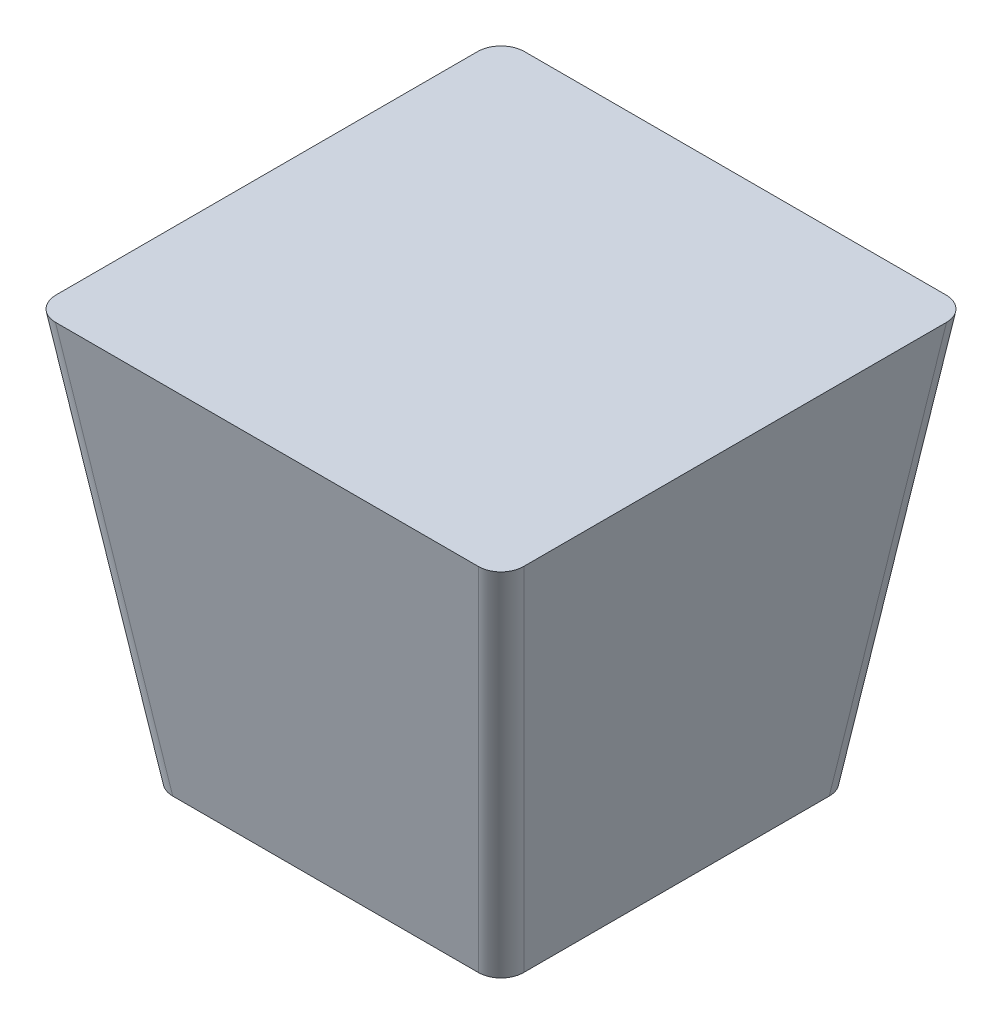
ISO-10303-21;
HEADER;
FILE_DESCRIPTION(('STEP AP214'),'2;1');
FILE_NAME('part.step','',(''),(''),'','','');
FILE_SCHEMA(('AUTOMOTIVE_DESIGN { 1 0 10303 214 1 1 1 1 }'));
ENDSEC;
DATA;
#1=APPLICATION_CONTEXT('core data for automotive mechanical design processes');
#2=APPLICATION_PROTOCOL_DEFINITION('international standard','automotive_design',2000,#1);
#3=PRODUCT_CONTEXT('',#1,'mechanical');
#4=PRODUCT('Part','Part','',(#3));
#5=PRODUCT_RELATED_PRODUCT_CATEGORY('part','',(#4));
#6=PRODUCT_DEFINITION_FORMATION('','',#4);
#7=PRODUCT_DEFINITION_CONTEXT('part definition',#1,'design');
#8=PRODUCT_DEFINITION('design','',#6,#7);
#9=PRODUCT_DEFINITION_SHAPE('','',#8);
#10=(LENGTH_UNIT() NAMED_UNIT(*) SI_UNIT(.MILLI.,.METRE.));
#11=(NAMED_UNIT(*) PLANE_ANGLE_UNIT() SI_UNIT($,.RADIAN.));
#12=(NAMED_UNIT(*) SI_UNIT($,.STERADIAN.) SOLID_ANGLE_UNIT());
#13=UNCERTAINTY_MEASURE_WITH_UNIT(LENGTH_MEASURE(1.E-05),#10,'distance_accuracy_value','');
#14=(GEOMETRIC_REPRESENTATION_CONTEXT(3) GLOBAL_UNCERTAINTY_ASSIGNED_CONTEXT((#13)) GLOBAL_UNIT_ASSIGNED_CONTEXT((#10,
#11,#12)) REPRESENTATION_CONTEXT('',''));
#15=CARTESIAN_POINT('',(0.,0.,0.));
#16=DIRECTION('',(0.,0.,1.));
#17=DIRECTION('',(1.,0.,0.));
#18=AXIS2_PLACEMENT_3D('',#15,#16,#17);
#19=CARTESIAN_POINT('',(-50.8077994428969,40.,-15.5431754874652));
#20=DIRECTION('',(1.,0.,0.));
#21=DIRECTION('',(0.,0.,-1.));
#22=AXIS2_PLACEMENT_3D('',#19,#20,#21);
#23=PLANE('',#22);
#24=DIRECTION('',(0.,0.,1.));
#25=VECTOR('',#24,1.);
#26=CARTESIAN_POINT('',(-50.8077994428969,0.,-15.5431754874652));
#27=LINE('',#26,#25);
#28=CARTESIAN_POINT('',(-50.8077994428969,0.,-13.5431754874652));
#29=VERTEX_POINT('',#28);
#30=CARTESIAN_POINT('',(-50.8077994428969,0.,12.395271699726));
#31=VERTEX_POINT('',#30);
#32=EDGE_CURVE('E162',#29,#31,#27,.T.);
#33=ORIENTED_EDGE('',*,*,#32,.T.);
#34=DIRECTION('',(0.,-0.970142500145332,-0.242535625036333));
#35=VECTOR('',#34,1.);
#36=CARTESIAN_POINT('',(-50.8077994428969,31.0733065441903,20.1635983357736));
#37=LINE('',#36,#35);
#38=CARTESIAN_POINT('',(-50.8077994428969,40.,22.395271699726));
#39=VERTEX_POINT('',#38);
#40=EDGE_CURVE('E139',#31,#39,#37,.F.);
#41=ORIENTED_EDGE('',*,*,#40,.T.);
#42=DIRECTION('',(0.,0.,1.));
#43=VECTOR('',#42,1.);
#44=CARTESIAN_POINT('',(-50.8077994428969,40.,-15.5431754874652));
#45=LINE('',#44,#43);
#46=CARTESIAN_POINT('',(-50.8077994428969,40.,-13.5431754874652));
#47=VERTEX_POINT('',#46);
#48=EDGE_CURVE('E105',#47,#39,#45,.T.);
#49=ORIENTED_EDGE('',*,*,#48,.F.);
#50=DIRECTION('',(0.,-1.,0.));
#51=VECTOR('',#50,1.);
#52=CARTESIAN_POINT('',(-50.8077994428969,40.,-13.5431754874652));
#53=LINE('',#52,#51);
#54=EDGE_CURVE('E136',#47,#29,#53,.T.);
#55=ORIENTED_EDGE('',*,*,#54,.T.);
#56=EDGE_LOOP('',(#33,#41,#49,#55));
#57=FACE_BOUND('',#56,.T.);
#58=ADVANCED_FACE('F35',(#57),#23,.F.);
#59=CARTESIAN_POINT('',(-50.8077994428969,40.,-15.5431754874652));
#60=DIRECTION('',(0.,0.,1.));
#61=DIRECTION('',(1.,0.,0.));
#62=AXIS2_PLACEMENT_3D('',#59,#60,#61);
#63=PLANE('',#62);
#64=DIRECTION('',(-1.,0.,0.));
#65=VECTOR('',#64,1.);
#66=CARTESIAN_POINT('',(-50.8077994428969,40.,-15.5431754874652));
#67=LINE('',#66,#65);
#68=CARTESIAN_POINT('',(-12.8693522557058,40.,-15.5431754874652));
#69=VERTEX_POINT('',#68);
#70=CARTESIAN_POINT('',(-48.8077994428969,40.,-15.5431754874652));
#71=VERTEX_POINT('',#70);
#72=EDGE_CURVE('E128',#69,#71,#67,.T.);
#73=ORIENTED_EDGE('',*,*,#72,.F.);
#74=DIRECTION('',(0.242535625036333,0.970142500145332,0.));
#75=VECTOR('',#74,1.);
#76=CARTESIAN_POINT('',(-15.1010256196582,31.0733065441903,-15.5431754874652));
#77=LINE('',#76,#75);
#78=CARTESIAN_POINT('',(-22.8693522557058,0.,-15.5431754874652));
#79=VERTEX_POINT('',#78);
#80=EDGE_CURVE('E11',#69,#79,#77,.F.);
#81=ORIENTED_EDGE('',*,*,#80,.T.);
#82=DIRECTION('',(-1.,0.,0.));
#83=VECTOR('',#82,1.);
#84=CARTESIAN_POINT('',(-50.8077994428969,0.,-15.5431754874652));
#85=LINE('',#84,#83);
#86=CARTESIAN_POINT('',(-48.8077994428969,0.,-15.5431754874652));
#87=VERTEX_POINT('',#86);
#88=EDGE_CURVE('E166',#79,#87,#85,.T.);
#89=ORIENTED_EDGE('',*,*,#88,.T.);
#90=DIRECTION('',(0.,-1.,0.));
#91=VECTOR('',#90,1.);
#92=CARTESIAN_POINT('',(-48.8077994428969,40.,-15.5431754874652));
#93=LINE('',#92,#91);
#94=EDGE_CURVE('E43',#87,#71,#93,.F.);
#95=ORIENTED_EDGE('',*,*,#94,.T.);
#96=EDGE_LOOP('',(#73,#81,#89,#95));
#97=FACE_BOUND('',#96,.T.);
#98=ADVANCED_FACE('F172',(#97),#63,.F.);
#99=CARTESIAN_POINT('',(0.,40.,0.));
#100=DIRECTION('',(0.,1.,0.));
#101=DIRECTION('',(0.,0.,1.));
#102=AXIS2_PLACEMENT_3D('',#99,#100,#101);
#103=PLANE('',#102);
#104=ORIENTED_EDGE('',*,*,#48,.T.);
#105=CARTESIAN_POINT('',(-48.8077994428969,40.,22.395271699726));
#106=DIRECTION('',(0.,1.,0.));
#107=DIRECTION('',(0.,0.,-1.));
#108=AXIS2_PLACEMENT_3D('',#105,#106,#107);
#109=ELLIPSE('',#108,2.06155281280883,2.);
#110=CARTESIAN_POINT('',(-48.8077994428969,40.,24.4568245125348));
#111=VERTEX_POINT('',#110);
#112=EDGE_CURVE('E99',#39,#111,#109,.T.);
#113=ORIENTED_EDGE('',*,*,#112,.T.);
#114=DIRECTION('',(1.,0.,0.));
#115=VECTOR('',#114,1.);
#116=CARTESIAN_POINT('',(-50.8077994428969,40.,24.4568245125348));
#117=LINE('',#116,#115);
#118=CARTESIAN_POINT('',(-12.7480844431876,40.,24.4568245125348));
#119=VERTEX_POINT('',#118);
#120=EDGE_CURVE('E102',#111,#119,#117,.T.);
#121=ORIENTED_EDGE('',*,*,#120,.T.);
#122=CARTESIAN_POINT('',(-12.8693522557058,40.,22.395271699726));
#123=DIRECTION('',(0.,1.,0.));
#124=DIRECTION('',(-0.707106781186547,0.,-0.707106781186548));
#125=AXIS2_PLACEMENT_3D('',#122,#123,#124);
#126=ELLIPSE('',#125,2.12132034355964,2.);
#127=CARTESIAN_POINT('',(-10.8077994428969,40.,22.5165395122442));
#128=VERTEX_POINT('',#127);
#129=EDGE_CURVE('E110',#119,#128,#126,.T.);
#130=ORIENTED_EDGE('',*,*,#129,.T.);
#131=DIRECTION('',(0.,0.,-1.));
#132=VECTOR('',#131,1.);
#133=CARTESIAN_POINT('',(-10.8077994428969,40.,-15.5431754874652));
#134=LINE('',#133,#132);
#135=CARTESIAN_POINT('',(-10.8077994428969,40.,-13.5431754874652));
#136=VERTEX_POINT('',#135);
#137=EDGE_CURVE('E120',#128,#136,#134,.T.);
#138=ORIENTED_EDGE('',*,*,#137,.T.);
#139=CARTESIAN_POINT('',(-12.8693522557058,40.,-13.5431754874652));
#140=DIRECTION('',(0.,1.,0.));
#141=DIRECTION('',(1.,0.,0.));
#142=AXIS2_PLACEMENT_3D('',#139,#140,#141);
#143=ELLIPSE('',#142,2.06155281280883,2.);
#144=EDGE_CURVE('E56',#136,#69,#143,.T.);
#145=ORIENTED_EDGE('',*,*,#144,.T.);
#146=ORIENTED_EDGE('',*,*,#72,.T.);
#147=CARTESIAN_POINT('',(-48.8077994428969,40.,-13.5431754874652));
#148=DIRECTION('',(0.,1.,0.));
#149=DIRECTION('',(0.,0.,1.));
#150=AXIS2_PLACEMENT_3D('',#147,#148,#149);
#151=CIRCLE('',#150,2.);
#152=EDGE_CURVE('E141',#71,#47,#151,.T.);
#153=ORIENTED_EDGE('',*,*,#152,.T.);
#154=EDGE_LOOP('',(#104,#113,#121,#130,#138,#145,#146,#153));
#155=FACE_BOUND('',#154,.T.);
#156=ADVANCED_FACE('F101',(#155),#103,.T.);
#157=CARTESIAN_POINT('',(0.,0.,0.));
#158=DIRECTION('',(0.,1.,0.));
#159=DIRECTION('',(0.,0.,1.));
#160=AXIS2_PLACEMENT_3D('',#157,#158,#159);
#161=PLANE('',#160);
#162=DIRECTION('',(-1.,0.,0.));
#163=VECTOR('',#162,1.);
#164=CARTESIAN_POINT('',(-10.8077994428969,0.,14.4568245125348));
#165=LINE('',#164,#163);
#166=CARTESIAN_POINT('',(-22.7480844431876,0.,14.4568245125348));
#167=VERTEX_POINT('',#166);
#168=CARTESIAN_POINT('',(-48.8077994428969,0.,14.4568245125348));
#169=VERTEX_POINT('',#168);
#170=EDGE_CURVE('E163',#167,#169,#165,.T.);
#171=ORIENTED_EDGE('',*,*,#170,.T.);
#172=CARTESIAN_POINT('',(-48.8077994428969,0.,12.395271699726));
#173=DIRECTION('',(0.,1.,0.));
#174=DIRECTION('',(0.,0.,-1.));
#175=AXIS2_PLACEMENT_3D('',#172,#173,#174);
#176=ELLIPSE('',#175,2.06155281280883,2.);
#177=EDGE_CURVE('E123',#169,#31,#176,.F.);
#178=ORIENTED_EDGE('',*,*,#177,.T.);
#179=ORIENTED_EDGE('',*,*,#32,.F.);
#180=CARTESIAN_POINT('',(-48.8077994428969,0.,-13.5431754874652));
#181=DIRECTION('',(0.,1.,0.));
#182=DIRECTION('',(0.,0.,1.));
#183=AXIS2_PLACEMENT_3D('',#180,#181,#182);
#184=CIRCLE('',#183,2.);
#185=EDGE_CURVE('E124',#29,#87,#184,.F.);
#186=ORIENTED_EDGE('',*,*,#185,.T.);
#187=ORIENTED_EDGE('',*,*,#88,.F.);
#188=CARTESIAN_POINT('',(-22.8693522557058,0.,-13.5431754874652));
#189=DIRECTION('',(0.,1.,0.));
#190=DIRECTION('',(1.,0.,0.));
#191=AXIS2_PLACEMENT_3D('',#188,#189,#190);
#192=ELLIPSE('',#191,2.06155281280883,2.);
#193=CARTESIAN_POINT('',(-20.8077994428969,0.,-13.5431754874652));
#194=VERTEX_POINT('',#193);
#195=EDGE_CURVE('E126',#79,#194,#192,.F.);
#196=ORIENTED_EDGE('',*,*,#195,.T.);
#197=DIRECTION('',(0.,0.,-1.));
#198=VECTOR('',#197,1.);
#199=CARTESIAN_POINT('',(-20.8077994428969,0.,24.4568245125348));
#200=LINE('',#199,#198);
#201=CARTESIAN_POINT('',(-20.8077994428969,0.,12.5165395122441));
#202=VERTEX_POINT('',#201);
#203=EDGE_CURVE('E155',#202,#194,#200,.T.);
#204=ORIENTED_EDGE('',*,*,#203,.F.);
#205=CARTESIAN_POINT('',(-22.8693522557058,0.,12.395271699726));
#206=DIRECTION('',(0.,1.,0.));
#207=DIRECTION('',(-0.707106781186547,0.,-0.707106781186548));
#208=AXIS2_PLACEMENT_3D('',#205,#206,#207);
#209=ELLIPSE('',#208,2.12132034355964,2.);
#210=EDGE_CURVE('E133',#202,#167,#209,.F.);
#211=ORIENTED_EDGE('',*,*,#210,.T.);
#212=EDGE_LOOP('',(#171,#178,#179,#186,#187,#196,#204,#211));
#213=FACE_BOUND('',#212,.T.);
#214=ADVANCED_FACE('F159',(#213),#161,.F.);
#215=CARTESIAN_POINT('',(-20.8077994428969,0.,24.4568245125348));
#216=DIRECTION('',(-0.970142500145332,0.242535625036333,0.));
#217=DIRECTION('',(-0.242535625036333,-0.970142500145332,0.));
#218=AXIS2_PLACEMENT_3D('',#215,#216,#217);
#219=PLANE('',#218);
#220=ORIENTED_EDGE('',*,*,#137,.F.);
#221=DIRECTION('',(-0.235702260395516,-0.942809041582063,-0.235702260395516));
#222=VECTOR('',#221,1.);
#223=CARTESIAN_POINT('',(-20.1444502762141,2.65339666673126,13.179888678927));
#224=LINE('',#223,#222);
#225=EDGE_CURVE('E147',#128,#202,#224,.T.);
#226=ORIENTED_EDGE('',*,*,#225,.T.);
#227=ORIENTED_EDGE('',*,*,#203,.T.);
#228=DIRECTION('',(0.242535625036333,0.970142500145332,0.));
#229=VECTOR('',#228,1.);
#230=CARTESIAN_POINT('',(-20.8077994428969,0.,-13.5431754874652));
#231=LINE('',#230,#229);
#232=EDGE_CURVE('E109',#194,#136,#231,.T.);
#233=ORIENTED_EDGE('',*,*,#232,.T.);
#234=EDGE_LOOP('',(#220,#226,#227,#233));
#235=FACE_BOUND('',#234,.T.);
#236=ADVANCED_FACE('F154',(#235),#219,.F.);
#237=CARTESIAN_POINT('',(-10.8077994428969,0.,14.4568245125348));
#238=DIRECTION('',(0.,0.242535625036333,-0.970142500145332));
#239=DIRECTION('',(0.,0.970142500145332,0.242535625036333));
#240=AXIS2_PLACEMENT_3D('',#237,#238,#239);
#241=PLANE('',#240);
#242=ORIENTED_EDGE('',*,*,#120,.F.);
#243=DIRECTION('',(0.,-0.970142500145332,-0.242535625036333));
#244=VECTOR('',#243,1.);
#245=CARTESIAN_POINT('',(-48.8077994428969,0.,14.4568245125348));
#246=LINE('',#245,#244);
#247=EDGE_CURVE('E116',#111,#169,#246,.T.);
#248=ORIENTED_EDGE('',*,*,#247,.T.);
#249=ORIENTED_EDGE('',*,*,#170,.F.);
#250=DIRECTION('',(-0.235702260395516,-0.942809041582063,-0.235702260395516));
#251=VECTOR('',#250,1.);
#252=CARTESIAN_POINT('',(-22.0847352765048,2.65339666673126,15.1201736792176));
#253=LINE('',#252,#251);
#254=EDGE_CURVE('E119',#167,#119,#253,.F.);
#255=ORIENTED_EDGE('',*,*,#254,.T.);
#256=EDGE_LOOP('',(#242,#248,#249,#255));
#257=FACE_BOUND('',#256,.T.);
#258=ADVANCED_FACE('F114',(#257),#241,.F.);
#259=CARTESIAN_POINT('',(-48.8077994428969,0.485071250072665,12.5165395122441));
#260=DIRECTION('',(0.,-0.970142500145332,-0.242535625036333));
#261=DIRECTION('',(0.,0.242535625036333,-0.970142500145332));
#262=AXIS2_PLACEMENT_3D('',#259,#260,#261);
#263=CYLINDRICAL_SURFACE('',#262,2.);
#264=ORIENTED_EDGE('',*,*,#112,.F.);
#265=ORIENTED_EDGE('',*,*,#40,.F.);
#266=ORIENTED_EDGE('',*,*,#177,.F.);
#267=ORIENTED_EDGE('',*,*,#247,.F.);
#268=EDGE_LOOP('',(#264,#265,#266,#267));
#269=FACE_BOUND('',#268,.T.);
#270=ADVANCED_FACE('F122',(#269),#263,.T.);
#271=CARTESIAN_POINT('',(-22.0847352765048,3.13846791680393,13.179888678927));
#272=DIRECTION('',(-0.235702260395516,-0.942809041582063,-0.235702260395516));
#273=DIRECTION('',(0.,0.242535625036333,-0.970142500145332));
#274=AXIS2_PLACEMENT_3D('',#271,#272,#273);
#275=CYLINDRICAL_SURFACE('',#274,2.);
#276=ORIENTED_EDGE('',*,*,#129,.F.);
#277=ORIENTED_EDGE('',*,*,#254,.F.);
#278=ORIENTED_EDGE('',*,*,#210,.F.);
#279=ORIENTED_EDGE('',*,*,#225,.F.);
#280=EDGE_LOOP('',(#276,#277,#278,#279));
#281=FACE_BOUND('',#280,.T.);
#282=ADVANCED_FACE('F179',(#281),#275,.T.);
#283=CARTESIAN_POINT('',(-22.7480844431876,0.485071250072666,-13.5431754874652));
#284=DIRECTION('',(0.242535625036333,0.970142500145332,0.));
#285=DIRECTION('',(-0.970142500145332,0.242535625036333,0.));
#286=AXIS2_PLACEMENT_3D('',#283,#284,#285);
#287=CYLINDRICAL_SURFACE('',#286,2.);
#288=ORIENTED_EDGE('',*,*,#195,.F.);
#289=ORIENTED_EDGE('',*,*,#80,.F.);
#290=ORIENTED_EDGE('',*,*,#144,.F.);
#291=ORIENTED_EDGE('',*,*,#232,.F.);
#292=EDGE_LOOP('',(#288,#289,#290,#291));
#293=FACE_BOUND('',#292,.T.);
#294=ADVANCED_FACE('F181',(#293),#287,.T.);
#295=CARTESIAN_POINT('',(-48.8077994428969,40.,-13.5431754874652));
#296=DIRECTION('',(0.,-1.,0.));
#297=DIRECTION('',(0.,0.,-1.));
#298=AXIS2_PLACEMENT_3D('',#295,#296,#297);
#299=CYLINDRICAL_SURFACE('',#298,2.);
#300=ORIENTED_EDGE('',*,*,#152,.F.);
#301=ORIENTED_EDGE('',*,*,#94,.F.);
#302=ORIENTED_EDGE('',*,*,#185,.F.);
#303=ORIENTED_EDGE('',*,*,#54,.F.);
#304=EDGE_LOOP('',(#300,#301,#302,#303));
#305=FACE_BOUND('',#304,.T.);
#306=ADVANCED_FACE('F37',(#305),#299,.T.);
#307=CLOSED_SHELL('',(#58,#98,#156,#214,#236,#258,#270,#282,#294,#306));
#308=MANIFOLD_SOLID_BREP('B2',#307);
#309=ADVANCED_BREP_SHAPE_REPRESENTATION('',(#18,#308),#14);
#310=SHAPE_DEFINITION_REPRESENTATION(#9,#309);
ENDSEC;
END-ISO-10303-21;
